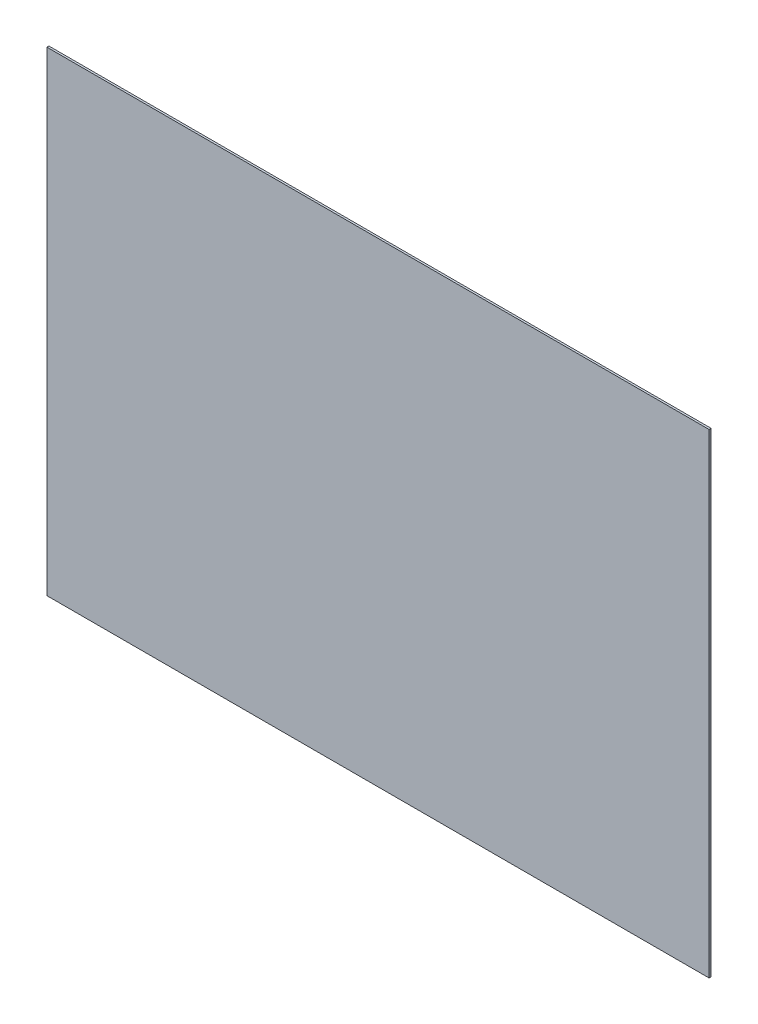
ISO-10303-21;
HEADER;
FILE_DESCRIPTION(('STEP AP214'),'2;1');
FILE_NAME('part.step','',(''),(''),'','','');
FILE_SCHEMA(('AUTOMOTIVE_DESIGN { 1 0 10303 214 1 1 1 1 }'));
ENDSEC;
DATA;
#1=APPLICATION_CONTEXT('core data for automotive mechanical design processes');
#2=APPLICATION_PROTOCOL_DEFINITION('international standard','automotive_design',2000,#1);
#3=PRODUCT_CONTEXT('',#1,'mechanical');
#4=PRODUCT('Part','Part','',(#3));
#5=PRODUCT_RELATED_PRODUCT_CATEGORY('part','',(#4));
#6=PRODUCT_DEFINITION_FORMATION('','',#4);
#7=PRODUCT_DEFINITION_CONTEXT('part definition',#1,'design');
#8=PRODUCT_DEFINITION('design','',#6,#7);
#9=PRODUCT_DEFINITION_SHAPE('','',#8);
#10=(LENGTH_UNIT() NAMED_UNIT(*) SI_UNIT(.MILLI.,.METRE.));
#11=(NAMED_UNIT(*) PLANE_ANGLE_UNIT() SI_UNIT($,.RADIAN.));
#12=(NAMED_UNIT(*) SI_UNIT($,.STERADIAN.) SOLID_ANGLE_UNIT());
#13=UNCERTAINTY_MEASURE_WITH_UNIT(LENGTH_MEASURE(1.E-05),#10,'distance_accuracy_value','');
#14=(GEOMETRIC_REPRESENTATION_CONTEXT(3) GLOBAL_UNCERTAINTY_ASSIGNED_CONTEXT((#13)) GLOBAL_UNIT_ASSIGNED_CONTEXT((#10,
#11,#12)) REPRESENTATION_CONTEXT('',''));
#15=CARTESIAN_POINT('',(0.,0.,0.));
#16=DIRECTION('',(0.,0.,1.));
#17=DIRECTION('',(1.,0.,0.));
#18=AXIS2_PLACEMENT_3D('',#15,#16,#17);
#19=CARTESIAN_POINT('',(247.7,177.7,1.5));
#20=DIRECTION('',(-1.,0.,0.));
#21=DIRECTION('',(0.,-1.,0.));
#22=AXIS2_PLACEMENT_3D('',#19,#20,#21);
#23=PLANE('',#22);
#24=DIRECTION('',(0.,1.,0.));
#25=VECTOR('',#24,1.);
#26=CARTESIAN_POINT('',(247.7,177.7,0.));
#27=LINE('',#26,#25);
#28=CARTESIAN_POINT('',(247.7,-177.7,0.));
#29=VERTEX_POINT('',#28);
#30=CARTESIAN_POINT('',(247.7,177.7,0.));
#31=VERTEX_POINT('',#30);
#32=EDGE_CURVE('E96',#29,#31,#27,.T.);
#33=ORIENTED_EDGE('',*,*,#32,.T.);
#34=DIRECTION('',(0.,0.,-1.));
#35=VECTOR('',#34,1.);
#36=CARTESIAN_POINT('',(247.7,177.7,1.5));
#37=LINE('',#36,#35);
#38=CARTESIAN_POINT('',(247.7,177.7,1.5));
#39=VERTEX_POINT('',#38);
#40=EDGE_CURVE('E11',#39,#31,#37,.T.);
#41=ORIENTED_EDGE('',*,*,#40,.F.);
#42=DIRECTION('',(0.,1.,0.));
#43=VECTOR('',#42,1.);
#44=CARTESIAN_POINT('',(247.7,177.7,1.5));
#45=LINE('',#44,#43);
#46=CARTESIAN_POINT('',(247.7,-177.7,1.5));
#47=VERTEX_POINT('',#46);
#48=EDGE_CURVE('E84',#47,#39,#45,.T.);
#49=ORIENTED_EDGE('',*,*,#48,.F.);
#50=DIRECTION('',(0.,0.,-1.));
#51=VECTOR('',#50,1.);
#52=CARTESIAN_POINT('',(247.7,-177.7,1.5));
#53=LINE('',#52,#51);
#54=EDGE_CURVE('E92',#47,#29,#53,.T.);
#55=ORIENTED_EDGE('',*,*,#54,.T.);
#56=EDGE_LOOP('',(#33,#41,#49,#55));
#57=FACE_BOUND('',#56,.T.);
#58=ADVANCED_FACE('F33',(#57),#23,.F.);
#59=CARTESIAN_POINT('',(-247.7,177.7,1.5));
#60=DIRECTION('',(0.,-1.,0.));
#61=DIRECTION('',(0.,0.,-1.));
#62=AXIS2_PLACEMENT_3D('',#59,#60,#61);
#63=PLANE('',#62);
#64=DIRECTION('',(-1.,0.,0.));
#65=VECTOR('',#64,1.);
#66=CARTESIAN_POINT('',(-247.7,177.7,0.));
#67=LINE('',#66,#65);
#68=CARTESIAN_POINT('',(-247.7,177.7,0.));
#69=VERTEX_POINT('',#68);
#70=EDGE_CURVE('E88',#31,#69,#67,.T.);
#71=ORIENTED_EDGE('',*,*,#70,.T.);
#72=DIRECTION('',(0.,0.,-1.));
#73=VECTOR('',#72,1.);
#74=CARTESIAN_POINT('',(-247.7,177.7,1.5));
#75=LINE('',#74,#73);
#76=CARTESIAN_POINT('',(-247.7,177.7,1.5));
#77=VERTEX_POINT('',#76);
#78=EDGE_CURVE('E41',#77,#69,#75,.T.);
#79=ORIENTED_EDGE('',*,*,#78,.F.);
#80=DIRECTION('',(-1.,0.,0.));
#81=VECTOR('',#80,1.);
#82=CARTESIAN_POINT('',(-247.7,177.7,1.5));
#83=LINE('',#82,#81);
#84=EDGE_CURVE('E79',#39,#77,#83,.T.);
#85=ORIENTED_EDGE('',*,*,#84,.F.);
#86=ORIENTED_EDGE('',*,*,#40,.T.);
#87=EDGE_LOOP('',(#71,#79,#85,#86));
#88=FACE_BOUND('',#87,.T.);
#89=ADVANCED_FACE('F87',(#88),#63,.F.);
#90=CARTESIAN_POINT('',(-247.7,177.7,1.5));
#91=DIRECTION('',(1.,0.,0.));
#92=DIRECTION('',(0.,1.,0.));
#93=AXIS2_PLACEMENT_3D('',#90,#91,#92);
#94=PLANE('',#93);
#95=DIRECTION('',(0.,-1.,0.));
#96=VECTOR('',#95,1.);
#97=CARTESIAN_POINT('',(-247.7,177.7,0.));
#98=LINE('',#97,#96);
#99=CARTESIAN_POINT('',(-247.7,-177.7,0.));
#100=VERTEX_POINT('',#99);
#101=EDGE_CURVE('E66',#69,#100,#98,.T.);
#102=ORIENTED_EDGE('',*,*,#101,.T.);
#103=DIRECTION('',(0.,0.,-1.));
#104=VECTOR('',#103,1.);
#105=CARTESIAN_POINT('',(-247.7,-177.7,1.5));
#106=LINE('',#105,#104);
#107=CARTESIAN_POINT('',(-247.7,-177.7,1.5));
#108=VERTEX_POINT('',#107);
#109=EDGE_CURVE('E89',#108,#100,#106,.T.);
#110=ORIENTED_EDGE('',*,*,#109,.F.);
#111=DIRECTION('',(0.,-1.,0.));
#112=VECTOR('',#111,1.);
#113=CARTESIAN_POINT('',(-247.7,177.7,1.5));
#114=LINE('',#113,#112);
#115=EDGE_CURVE('E82',#77,#108,#114,.T.);
#116=ORIENTED_EDGE('',*,*,#115,.F.);
#117=ORIENTED_EDGE('',*,*,#78,.T.);
#118=EDGE_LOOP('',(#102,#110,#116,#117));
#119=FACE_BOUND('',#118,.T.);
#120=ADVANCED_FACE('F90',(#119),#94,.F.);
#121=CARTESIAN_POINT('',(-247.7,-177.7,1.5));
#122=DIRECTION('',(0.,1.,0.));
#123=DIRECTION('',(0.,0.,1.));
#124=AXIS2_PLACEMENT_3D('',#121,#122,#123);
#125=PLANE('',#124);
#126=DIRECTION('',(1.,0.,0.));
#127=VECTOR('',#126,1.);
#128=CARTESIAN_POINT('',(-247.7,-177.7,0.));
#129=LINE('',#128,#127);
#130=EDGE_CURVE('E72',#100,#29,#129,.T.);
#131=ORIENTED_EDGE('',*,*,#130,.T.);
#132=ORIENTED_EDGE('',*,*,#54,.F.);
#133=DIRECTION('',(1.,0.,0.));
#134=VECTOR('',#133,1.);
#135=CARTESIAN_POINT('',(-247.7,-177.7,1.5));
#136=LINE('',#135,#134);
#137=EDGE_CURVE('E49',#108,#47,#136,.T.);
#138=ORIENTED_EDGE('',*,*,#137,.F.);
#139=ORIENTED_EDGE('',*,*,#109,.T.);
#140=EDGE_LOOP('',(#131,#132,#138,#139));
#141=FACE_BOUND('',#140,.T.);
#142=ADVANCED_FACE('F103',(#141),#125,.F.);
#143=CARTESIAN_POINT('',(0.,0.,1.5));
#144=DIRECTION('',(0.,0.,1.));
#145=DIRECTION('',(1.,0.,0.));
#146=AXIS2_PLACEMENT_3D('',#143,#144,#145);
#147=PLANE('',#146);
#148=ORIENTED_EDGE('',*,*,#48,.T.);
#149=ORIENTED_EDGE('',*,*,#84,.T.);
#150=ORIENTED_EDGE('',*,*,#115,.T.);
#151=ORIENTED_EDGE('',*,*,#137,.T.);
#152=EDGE_LOOP('',(#148,#149,#150,#151));
#153=FACE_BOUND('',#152,.T.);
#154=ADVANCED_FACE('F80',(#153),#147,.T.);
#155=CARTESIAN_POINT('',(0.,0.,0.));
#156=DIRECTION('',(0.,0.,1.));
#157=DIRECTION('',(1.,0.,0.));
#158=AXIS2_PLACEMENT_3D('',#155,#156,#157);
#159=PLANE('',#158);
#160=ORIENTED_EDGE('',*,*,#32,.F.);
#161=ORIENTED_EDGE('',*,*,#130,.F.);
#162=ORIENTED_EDGE('',*,*,#101,.F.);
#163=ORIENTED_EDGE('',*,*,#70,.F.);
#164=EDGE_LOOP('',(#160,#161,#162,#163));
#165=FACE_BOUND('',#164,.T.);
#166=ADVANCED_FACE('F106',(#165),#159,.F.);
#167=CLOSED_SHELL('',(#58,#89,#120,#142,#154,#166));
#168=MANIFOLD_SOLID_BREP('B2',#167);
#169=ADVANCED_BREP_SHAPE_REPRESENTATION('',(#18,#168),#14);
#170=SHAPE_DEFINITION_REPRESENTATION(#9,#169);
ENDSEC;
END-ISO-10303-21;
